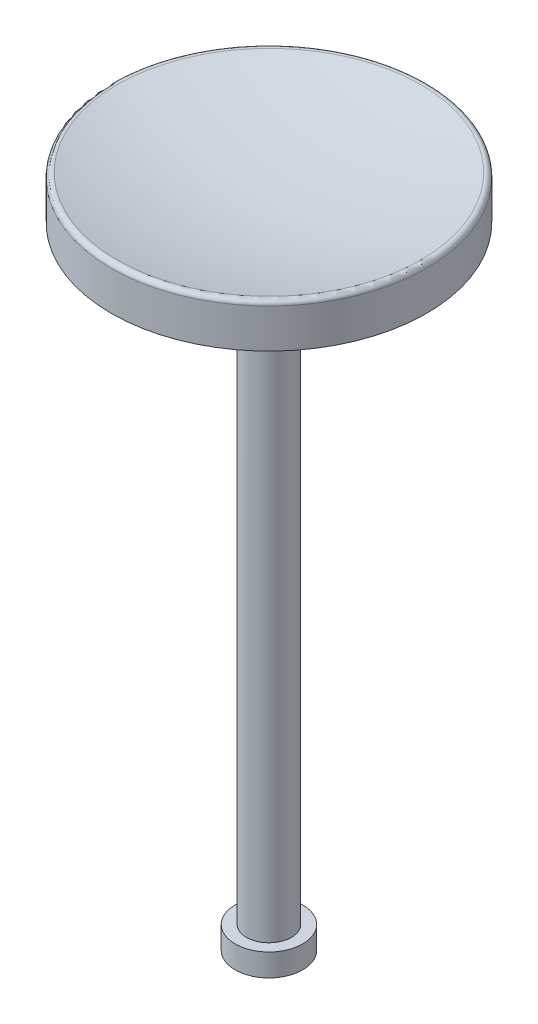
ISO-10303-21;
HEADER;
FILE_DESCRIPTION(('STEP AP214'),'2;1');
FILE_NAME('part.step','',(''),(''),'','','');
FILE_SCHEMA(('AUTOMOTIVE_DESIGN { 1 0 10303 214 1 1 1 1 }'));
ENDSEC;
DATA;
#1=APPLICATION_CONTEXT('core data for automotive mechanical design processes');
#2=APPLICATION_PROTOCOL_DEFINITION('international standard','automotive_design',2000,#1);
#3=PRODUCT_CONTEXT('',#1,'mechanical');
#4=PRODUCT('Part','Part','',(#3));
#5=PRODUCT_RELATED_PRODUCT_CATEGORY('part','',(#4));
#6=PRODUCT_DEFINITION_FORMATION('','',#4);
#7=PRODUCT_DEFINITION_CONTEXT('part definition',#1,'design');
#8=PRODUCT_DEFINITION('design','',#6,#7);
#9=PRODUCT_DEFINITION_SHAPE('','',#8);
#10=(LENGTH_UNIT() NAMED_UNIT(*) SI_UNIT(.MILLI.,.METRE.));
#11=(NAMED_UNIT(*) PLANE_ANGLE_UNIT() SI_UNIT($,.RADIAN.));
#12=(NAMED_UNIT(*) SI_UNIT($,.STERADIAN.) SOLID_ANGLE_UNIT());
#13=UNCERTAINTY_MEASURE_WITH_UNIT(LENGTH_MEASURE(1.E-05),#10,'distance_accuracy_value','');
#14=(GEOMETRIC_REPRESENTATION_CONTEXT(3) GLOBAL_UNCERTAINTY_ASSIGNED_CONTEXT((#13)) GLOBAL_UNIT_ASSIGNED_CONTEXT((#10,
#11,#12)) REPRESENTATION_CONTEXT('',''));
#15=CARTESIAN_POINT('',(0.,0.,0.));
#16=DIRECTION('',(0.,0.,1.));
#17=DIRECTION('',(1.,0.,0.));
#18=AXIS2_PLACEMENT_3D('',#15,#16,#17);
#19=CARTESIAN_POINT('',(0.,177.8,0.));
#20=DIRECTION('',(0.,-1.,0.));
#21=DIRECTION('',(0.,0.,-1.));
#22=AXIS2_PLACEMENT_3D('',#19,#20,#21);
#23=CYLINDRICAL_SURFACE('',#22,6.35);
#24=CARTESIAN_POINT('',(0.,177.8,0.));
#25=DIRECTION('',(0.,1.,0.));
#26=DIRECTION('',(0.,0.,1.));
#27=AXIS2_PLACEMENT_3D('',#24,#25,#26);
#28=CIRCLE('',#27,6.35);
#29=CARTESIAN_POINT('',(0.,177.8,6.35));
#30=VERTEX_POINT('',#29);
#31=EDGE_CURVE('E44',#30,#30,#28,.T.);
#32=ORIENTED_EDGE('',*,*,#31,.F.);
#33=EDGE_LOOP('',(#32));
#34=FACE_BOUND('',#33,.T.);
#35=CARTESIAN_POINT('',(0.,6.34999999999999,0.));
#36=DIRECTION('',(0.,-1.,0.));
#37=DIRECTION('',(0.,0.,-1.));
#38=AXIS2_PLACEMENT_3D('',#35,#36,#37);
#39=CIRCLE('',#38,6.35);
#40=CARTESIAN_POINT('',(0.,6.34999999999999,-6.35));
#41=VERTEX_POINT('',#40);
#42=EDGE_CURVE('E10',#41,#41,#39,.T.);
#43=ORIENTED_EDGE('',*,*,#42,.F.);
#44=EDGE_LOOP('',(#43));
#45=FACE_BOUND('',#44,.T.);
#46=ADVANCED_FACE('F37',(#34,#45),#23,.T.);
#47=CARTESIAN_POINT('',(0.,177.8,0.));
#48=DIRECTION('',(0.,-1.,0.));
#49=DIRECTION('',(0.,0.,-1.));
#50=AXIS2_PLACEMENT_3D('',#47,#48,#49);
#51=PLANE('',#50);
#52=ORIENTED_EDGE('',*,*,#31,.T.);
#53=EDGE_LOOP('',(#52));
#54=FACE_BOUND('',#53,.T.);
#55=CARTESIAN_POINT('',(0.,177.8,0.));
#56=DIRECTION('',(0.,1.,0.));
#57=DIRECTION('',(0.,0.,1.));
#58=AXIS2_PLACEMENT_3D('',#55,#56,#57);
#59=CIRCLE('',#58,44.45);
#60=CARTESIAN_POINT('',(0.,177.8,44.45));
#61=VERTEX_POINT('',#60);
#62=EDGE_CURVE('E60',#61,#61,#59,.T.);
#63=ORIENTED_EDGE('',*,*,#62,.F.);
#64=EDGE_LOOP('',(#63));
#65=FACE_BOUND('',#64,.T.);
#66=ADVANCED_FACE('F95',(#54,#65),#51,.T.);
#67=CARTESIAN_POINT('',(0.,184.15,0.));
#68=DIRECTION('',(0.,1.,0.));
#69=DIRECTION('',(0.,0.,1.));
#70=AXIS2_PLACEMENT_3D('',#67,#68,#69);
#71=CYLINDRICAL_SURFACE('',#70,44.45);
#72=ORIENTED_EDGE('',*,*,#62,.T.);
#73=EDGE_LOOP('',(#72));
#74=FACE_BOUND('',#73,.T.);
#75=CARTESIAN_POINT('',(0.,188.815970976873,0.));
#76=DIRECTION('',(0.,1.,0.));
#77=DIRECTION('',(0.,0.,1.));
#78=AXIS2_PLACEMENT_3D('',#75,#76,#77);
#79=CIRCLE('',#78,44.45);
#80=CARTESIAN_POINT('',(0.,188.815970976873,44.45));
#81=VERTEX_POINT('',#80);
#82=EDGE_CURVE('E64',#81,#81,#79,.T.);
#83=ORIENTED_EDGE('',*,*,#82,.F.);
#84=EDGE_LOOP('',(#83));
#85=FACE_BOUND('',#84,.T.);
#86=ADVANCED_FACE('F103',(#74,#85),#71,.T.);
#87=CARTESIAN_POINT('',(0.,188.815970976873,0.));
#88=DIRECTION('',(0.,1.,0.));
#89=DIRECTION('',(0.,0.,1.));
#90=AXIS2_PLACEMENT_3D('',#87,#88,#89);
#91=TOROIDAL_SURFACE('',#90,43.18,1.26999999999999);
#92=ORIENTED_EDGE('',*,*,#82,.T.);
#93=EDGE_LOOP('',(#92));
#94=FACE_BOUND('',#93,.T.);
#95=CARTESIAN_POINT('',(0.,190.038860096104,0.));
#96=DIRECTION('',(0.,1.,0.));
#97=DIRECTION('',(0.,0.,1.));
#98=AXIS2_PLACEMENT_3D('',#95,#96,#97);
#99=CIRCLE('',#98,42.8373015873016);
#100=CARTESIAN_POINT('',(0.,190.038860096104,42.8373015873016));
#101=VERTEX_POINT('',#100);
#102=EDGE_CURVE('E68',#101,#101,#99,.T.);
#103=ORIENTED_EDGE('',*,*,#102,.F.);
#104=EDGE_LOOP('',(#103));
#105=FACE_BOUND('',#104,.T.);
#106=ADVANCED_FACE('F108',(#94,#105),#91,.T.);
#107=CARTESIAN_POINT('',(0.,342.9,0.));
#108=DIRECTION('',(0.,1.,0.));
#109=DIRECTION('',(0.,0.,1.));
#110=AXIS2_PLACEMENT_3D('',#107,#108,#109);
#111=SPHERICAL_SURFACE('',#110,158.75);
#112=ORIENTED_EDGE('',*,*,#102,.T.);
#113=EDGE_LOOP('',(#112));
#114=FACE_BOUND('',#113,.T.);
#115=ADVANCED_FACE('F96',(#114),#111,.F.);
#116=CARTESIAN_POINT('',(0.,6.35,0.));
#117=DIRECTION('',(0.,-1.,0.));
#118=DIRECTION('',(0.,0.,-1.));
#119=AXIS2_PLACEMENT_3D('',#116,#117,#118);
#120=CYLINDRICAL_SURFACE('',#119,9.525);
#121=CARTESIAN_POINT('',(0.,6.35,0.));
#122=DIRECTION('',(0.,-1.,0.));
#123=DIRECTION('',(0.,0.,-1.));
#124=AXIS2_PLACEMENT_3D('',#121,#122,#123);
#125=CIRCLE('',#124,9.525);
#126=CARTESIAN_POINT('',(0.,6.35,-9.525));
#127=VERTEX_POINT('',#126);
#128=EDGE_CURVE('E72',#127,#127,#125,.T.);
#129=ORIENTED_EDGE('',*,*,#128,.T.);
#130=EDGE_LOOP('',(#129));
#131=FACE_BOUND('',#130,.T.);
#132=CARTESIAN_POINT('',(0.,0.,0.));
#133=DIRECTION('',(0.,-1.,0.));
#134=DIRECTION('',(0.,0.,-1.));
#135=AXIS2_PLACEMENT_3D('',#132,#133,#134);
#136=CIRCLE('',#135,9.525);
#137=CARTESIAN_POINT('',(0.,0.,-9.525));
#138=VERTEX_POINT('',#137);
#139=EDGE_CURVE('E73',#138,#138,#136,.T.);
#140=ORIENTED_EDGE('',*,*,#139,.F.);
#141=EDGE_LOOP('',(#140));
#142=FACE_BOUND('',#141,.T.);
#143=ADVANCED_FACE('F81',(#131,#142),#120,.T.);
#144=CARTESIAN_POINT('',(0.,6.35,0.));
#145=DIRECTION('',(0.,-1.,0.));
#146=DIRECTION('',(0.,0.,-1.));
#147=AXIS2_PLACEMENT_3D('',#144,#145,#146);
#148=PLANE('',#147);
#149=ORIENTED_EDGE('',*,*,#42,.T.);
#150=EDGE_LOOP('',(#149));
#151=FACE_BOUND('',#150,.T.);
#152=ORIENTED_EDGE('',*,*,#128,.F.);
#153=EDGE_LOOP('',(#152));
#154=FACE_BOUND('',#153,.T.);
#155=ADVANCED_FACE('F84',(#151,#154),#148,.F.);
#156=CARTESIAN_POINT('',(0.,177.8,0.));
#157=DIRECTION('',(0.,1.,0.));
#158=DIRECTION('',(0.,0.,1.));
#159=AXIS2_PLACEMENT_3D('',#156,#157,#158);
#160=CIRCLE('',#159,3.175);
#161=CARTESIAN_POINT('',(0.,177.8,3.175));
#162=VERTEX_POINT('',#161);
#163=EDGE_CURVE('E54',#162,#162,#160,.T.);
#164=ORIENTED_EDGE('',*,*,#163,.F.);
#165=EDGE_LOOP('',(#164));
#166=FACE_BOUND('',#165,.T.);
#167=ADVANCED_FACE('F86',(#166),#51,.T.);
#168=CARTESIAN_POINT('',(0.,177.8,0.));
#169=DIRECTION('',(0.,-1.,0.));
#170=DIRECTION('',(0.,0.,-1.));
#171=AXIS2_PLACEMENT_3D('',#168,#169,#170);
#172=CYLINDRICAL_SURFACE('',#171,3.175);
#173=ORIENTED_EDGE('',*,*,#163,.T.);
#174=EDGE_LOOP('',(#173));
#175=FACE_BOUND('',#174,.T.);
#176=CARTESIAN_POINT('',(0.,0.,0.));
#177=DIRECTION('',(0.,1.,0.));
#178=DIRECTION('',(0.,0.,1.));
#179=AXIS2_PLACEMENT_3D('',#176,#177,#178);
#180=CIRCLE('',#179,3.175);
#181=CARTESIAN_POINT('',(0.,0.,3.175));
#182=VERTEX_POINT('',#181);
#183=EDGE_CURVE('E49',#182,#182,#180,.T.);
#184=ORIENTED_EDGE('',*,*,#183,.F.);
#185=EDGE_LOOP('',(#184));
#186=FACE_BOUND('',#185,.T.);
#187=ADVANCED_FACE('F92',(#175,#186),#172,.F.);
#188=CARTESIAN_POINT('',(0.,0.,0.));
#189=DIRECTION('',(0.,1.,0.));
#190=DIRECTION('',(0.,0.,1.));
#191=AXIS2_PLACEMENT_3D('',#188,#189,#190);
#192=PLANE('',#191);
#193=ORIENTED_EDGE('',*,*,#183,.T.);
#194=EDGE_LOOP('',(#193));
#195=FACE_BOUND('',#194,.T.);
#196=ORIENTED_EDGE('',*,*,#139,.T.);
#197=EDGE_LOOP('',(#196));
#198=FACE_BOUND('',#197,.T.);
#199=ADVANCED_FACE('F115',(#195,#198),#192,.F.);
#200=CLOSED_SHELL('',(#46,#66,#86,#106,#115,#143,#155,#167,#187,#199));
#201=MANIFOLD_SOLID_BREP('B2',#200);
#202=ADVANCED_BREP_SHAPE_REPRESENTATION('',(#18,#201),#14);
#203=SHAPE_DEFINITION_REPRESENTATION(#9,#202);
ENDSEC;
END-ISO-10303-21;
